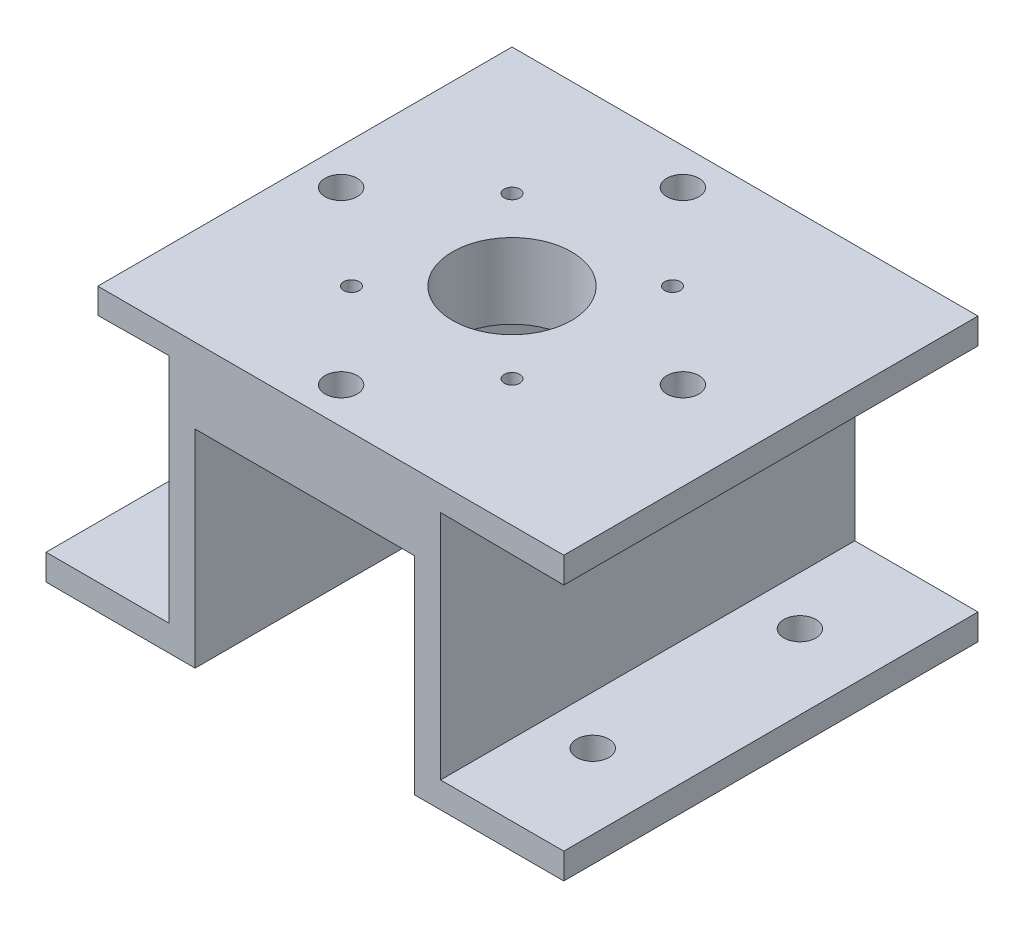
ISO-10303-21;
HEADER;
FILE_DESCRIPTION(('STEP AP214'),'2;1');
FILE_NAME('part.step','',(''),(''),'','','');
FILE_SCHEMA(('AUTOMOTIVE_DESIGN { 1 0 10303 214 1 1 1 1 }'));
ENDSEC;
DATA;
#1=APPLICATION_CONTEXT('core data for automotive mechanical design processes');
#2=APPLICATION_PROTOCOL_DEFINITION('international standard','automotive_design',2000,#1);
#3=PRODUCT_CONTEXT('',#1,'mechanical');
#4=PRODUCT('Part','Part','',(#3));
#5=PRODUCT_RELATED_PRODUCT_CATEGORY('part','',(#4));
#6=PRODUCT_DEFINITION_FORMATION('','',#4);
#7=PRODUCT_DEFINITION_CONTEXT('part definition',#1,'design');
#8=PRODUCT_DEFINITION('design','',#6,#7);
#9=PRODUCT_DEFINITION_SHAPE('','',#8);
#10=(LENGTH_UNIT() NAMED_UNIT(*) SI_UNIT(.MILLI.,.METRE.));
#11=(NAMED_UNIT(*) PLANE_ANGLE_UNIT() SI_UNIT($,.RADIAN.));
#12=(NAMED_UNIT(*) SI_UNIT($,.STERADIAN.) SOLID_ANGLE_UNIT());
#13=UNCERTAINTY_MEASURE_WITH_UNIT(LENGTH_MEASURE(1.E-05),#10,'distance_accuracy_value','');
#14=(GEOMETRIC_REPRESENTATION_CONTEXT(3) GLOBAL_UNCERTAINTY_ASSIGNED_CONTEXT((#13)) GLOBAL_UNIT_ASSIGNED_CONTEXT((#10,
#11,#12)) REPRESENTATION_CONTEXT('',''));
#15=CARTESIAN_POINT('',(0.,0.,0.));
#16=DIRECTION('',(0.,0.,1.));
#17=DIRECTION('',(1.,0.,0.));
#18=AXIS2_PLACEMENT_3D('',#15,#16,#17);
#19=CARTESIAN_POINT('',(21.2,0.,40.));
#20=DIRECTION('',(1.,0.,0.));
#21=DIRECTION('',(0.,1.,0.));
#22=AXIS2_PLACEMENT_3D('',#19,#20,#21);
#23=PLANE('',#22);
#24=DIRECTION('',(0.,-1.,0.));
#25=VECTOR('',#24,1.);
#26=CARTESIAN_POINT('',(21.2,0.,-40.));
#27=LINE('',#26,#25);
#28=CARTESIAN_POINT('',(21.2,0.,-40.));
#29=VERTEX_POINT('',#28);
#30=CARTESIAN_POINT('',(21.2,-40.,-40.));
#31=VERTEX_POINT('',#30);
#32=EDGE_CURVE('E176',#29,#31,#27,.T.);
#33=ORIENTED_EDGE('',*,*,#32,.T.);
#34=DIRECTION('',(0.,0.,-1.));
#35=VECTOR('',#34,1.);
#36=CARTESIAN_POINT('',(21.2,-40.,40.));
#37=LINE('',#36,#35);
#38=CARTESIAN_POINT('',(21.2,-40.,40.));
#39=VERTEX_POINT('',#38);
#40=EDGE_CURVE('E39',#39,#31,#37,.T.);
#41=ORIENTED_EDGE('',*,*,#40,.F.);
#42=DIRECTION('',(0.,-1.,0.));
#43=VECTOR('',#42,1.);
#44=CARTESIAN_POINT('',(21.2,0.,40.));
#45=LINE('',#44,#43);
#46=CARTESIAN_POINT('',(21.2,0.,40.));
#47=VERTEX_POINT('',#46);
#48=EDGE_CURVE('E209',#47,#39,#45,.T.);
#49=ORIENTED_EDGE('',*,*,#48,.F.);
#50=DIRECTION('',(0.,0.,-1.));
#51=VECTOR('',#50,1.);
#52=CARTESIAN_POINT('',(21.2,0.,40.));
#53=LINE('',#52,#51);
#54=EDGE_CURVE('E172',#47,#29,#53,.T.);
#55=ORIENTED_EDGE('',*,*,#54,.T.);
#56=EDGE_LOOP('',(#33,#41,#49,#55));
#57=FACE_BOUND('',#56,.T.);
#58=ADVANCED_FACE('F32',(#57),#23,.F.);
#59=CARTESIAN_POINT('',(21.2,-40.,40.));
#60=DIRECTION('',(0.,1.,0.));
#61=DIRECTION('',(0.,0.,1.));
#62=AXIS2_PLACEMENT_3D('',#59,#60,#61);
#63=PLANE('',#62);
#64=CARTESIAN_POINT('',(35.6,-40.,-20.));
#65=DIRECTION('',(0.,-1.,0.));
#66=DIRECTION('',(0.,0.,-1.));
#67=AXIS2_PLACEMENT_3D('',#64,#65,#66);
#68=CIRCLE('',#67,3.1);
#69=CARTESIAN_POINT('',(35.6,-40.,-23.1));
#70=VERTEX_POINT('',#69);
#71=EDGE_CURVE('E379',#70,#70,#68,.T.);
#72=ORIENTED_EDGE('',*,*,#71,.F.);
#73=EDGE_LOOP('',(#72));
#74=FACE_BOUND('',#73,.T.);
#75=CARTESIAN_POINT('',(35.6,-40.,20.));
#76=DIRECTION('',(0.,-1.,0.));
#77=DIRECTION('',(0.,0.,-1.));
#78=AXIS2_PLACEMENT_3D('',#75,#76,#77);
#79=CIRCLE('',#78,3.1);
#80=CARTESIAN_POINT('',(35.6,-40.,16.9));
#81=VERTEX_POINT('',#80);
#82=EDGE_CURVE('E382',#81,#81,#79,.T.);
#83=ORIENTED_EDGE('',*,*,#82,.F.);
#84=EDGE_LOOP('',(#83));
#85=FACE_BOUND('',#84,.T.);
#86=DIRECTION('',(1.,0.,0.));
#87=VECTOR('',#86,1.);
#88=CARTESIAN_POINT('',(21.2,-40.,-40.));
#89=LINE('',#88,#87);
#90=CARTESIAN_POINT('',(50.,-40.,-40.));
#91=VERTEX_POINT('',#90);
#92=EDGE_CURVE('E179',#31,#91,#89,.T.);
#93=ORIENTED_EDGE('',*,*,#92,.T.);
#94=DIRECTION('',(0.,0.,-1.));
#95=VECTOR('',#94,1.);
#96=CARTESIAN_POINT('',(50.,-40.,40.));
#97=LINE('',#96,#95);
#98=CARTESIAN_POINT('',(50.,-40.,40.));
#99=VERTEX_POINT('',#98);
#100=EDGE_CURVE('E237',#99,#91,#97,.T.);
#101=ORIENTED_EDGE('',*,*,#100,.F.);
#102=DIRECTION('',(1.,0.,0.));
#103=VECTOR('',#102,1.);
#104=CARTESIAN_POINT('',(21.2,-40.,40.));
#105=LINE('',#104,#103);
#106=EDGE_CURVE('E113',#39,#99,#105,.T.);
#107=ORIENTED_EDGE('',*,*,#106,.F.);
#108=ORIENTED_EDGE('',*,*,#40,.T.);
#109=EDGE_LOOP('',(#93,#101,#107,#108));
#110=FACE_BOUND('',#109,.T.);
#111=ADVANCED_FACE('F341',(#74,#85,#110),#63,.F.);
#112=CARTESIAN_POINT('',(50.,-35.,40.));
#113=DIRECTION('',(-1.,0.,0.));
#114=DIRECTION('',(0.,0.,1.));
#115=AXIS2_PLACEMENT_3D('',#112,#113,#114);
#116=PLANE('',#115);
#117=DIRECTION('',(0.,1.,0.));
#118=VECTOR('',#117,1.);
#119=CARTESIAN_POINT('',(50.,-35.,-40.));
#120=LINE('',#119,#118);
#121=CARTESIAN_POINT('',(50.,-35.,-40.));
#122=VERTEX_POINT('',#121);
#123=EDGE_CURVE('E182',#91,#122,#120,.T.);
#124=ORIENTED_EDGE('',*,*,#123,.T.);
#125=DIRECTION('',(0.,0.,-1.));
#126=VECTOR('',#125,1.);
#127=CARTESIAN_POINT('',(50.,-35.,40.));
#128=LINE('',#127,#126);
#129=CARTESIAN_POINT('',(50.,-35.,40.));
#130=VERTEX_POINT('',#129);
#131=EDGE_CURVE('E234',#130,#122,#128,.T.);
#132=ORIENTED_EDGE('',*,*,#131,.F.);
#133=DIRECTION('',(0.,1.,0.));
#134=VECTOR('',#133,1.);
#135=CARTESIAN_POINT('',(50.,-35.,40.));
#136=LINE('',#135,#134);
#137=EDGE_CURVE('E303',#99,#130,#136,.T.);
#138=ORIENTED_EDGE('',*,*,#137,.F.);
#139=ORIENTED_EDGE('',*,*,#100,.T.);
#140=EDGE_LOOP('',(#124,#132,#138,#139));
#141=FACE_BOUND('',#140,.T.);
#142=ADVANCED_FACE('F344',(#141),#116,.F.);
#143=CARTESIAN_POINT('',(26.2,-35.,40.));
#144=DIRECTION('',(0.,-1.,0.));
#145=DIRECTION('',(1.,0.,0.));
#146=AXIS2_PLACEMENT_3D('',#143,#144,#145);
#147=PLANE('',#146);
#148=CARTESIAN_POINT('',(35.6,-35.,-20.));
#149=DIRECTION('',(0.,-1.,0.));
#150=DIRECTION('',(1.,0.,0.));
#151=AXIS2_PLACEMENT_3D('',#148,#149,#150);
#152=CIRCLE('',#151,3.1);
#153=CARTESIAN_POINT('',(38.7,-35.,-20.));
#154=VERTEX_POINT('',#153);
#155=EDGE_CURVE('E269',#154,#154,#152,.T.);
#156=ORIENTED_EDGE('',*,*,#155,.T.);
#157=EDGE_LOOP('',(#156));
#158=FACE_BOUND('',#157,.T.);
#159=CARTESIAN_POINT('',(35.6,-35.,20.));
#160=DIRECTION('',(0.,-1.,0.));
#161=DIRECTION('',(1.,0.,0.));
#162=AXIS2_PLACEMENT_3D('',#159,#160,#161);
#163=CIRCLE('',#162,3.1);
#164=CARTESIAN_POINT('',(38.7,-35.,20.));
#165=VERTEX_POINT('',#164);
#166=EDGE_CURVE('E267',#165,#165,#163,.T.);
#167=ORIENTED_EDGE('',*,*,#166,.T.);
#168=EDGE_LOOP('',(#167));
#169=FACE_BOUND('',#168,.T.);
#170=DIRECTION('',(-1.,0.,0.));
#171=VECTOR('',#170,1.);
#172=CARTESIAN_POINT('',(26.2,-35.,-40.));
#173=LINE('',#172,#171);
#174=CARTESIAN_POINT('',(26.2,-35.,-40.));
#175=VERTEX_POINT('',#174);
#176=EDGE_CURVE('E184',#122,#175,#173,.T.);
#177=ORIENTED_EDGE('',*,*,#176,.T.);
#178=DIRECTION('',(0.,0.,-1.));
#179=VECTOR('',#178,1.);
#180=CARTESIAN_POINT('',(26.2,-35.,40.));
#181=LINE('',#180,#179);
#182=CARTESIAN_POINT('',(26.2,-35.,40.));
#183=VERTEX_POINT('',#182);
#184=EDGE_CURVE('E231',#183,#175,#181,.T.);
#185=ORIENTED_EDGE('',*,*,#184,.F.);
#186=DIRECTION('',(-1.,0.,0.));
#187=VECTOR('',#186,1.);
#188=CARTESIAN_POINT('',(26.2,-35.,40.));
#189=LINE('',#188,#187);
#190=EDGE_CURVE('E305',#130,#183,#189,.T.);
#191=ORIENTED_EDGE('',*,*,#190,.F.);
#192=ORIENTED_EDGE('',*,*,#131,.T.);
#193=EDGE_LOOP('',(#177,#185,#191,#192));
#194=FACE_BOUND('',#193,.T.);
#195=ADVANCED_FACE('F349',(#158,#169,#194),#147,.F.);
#196=CARTESIAN_POINT('',(26.2,5.,40.));
#197=DIRECTION('',(-1.,0.,0.));
#198=DIRECTION('',(0.,0.,1.));
#199=AXIS2_PLACEMENT_3D('',#196,#197,#198);
#200=PLANE('',#199);
#201=DIRECTION('',(0.,1.,0.));
#202=VECTOR('',#201,1.);
#203=CARTESIAN_POINT('',(26.2,5.,-40.));
#204=LINE('',#203,#202);
#205=CARTESIAN_POINT('',(26.2,9.75000000000001,-40.));
#206=VERTEX_POINT('',#205);
#207=EDGE_CURVE('E187',#175,#206,#204,.T.);
#208=ORIENTED_EDGE('',*,*,#207,.T.);
#209=DIRECTION('',(0.,0.,-1.));
#210=VECTOR('',#209,1.);
#211=CARTESIAN_POINT('',(26.2,9.75000000000001,40.));
#212=LINE('',#211,#210);
#213=CARTESIAN_POINT('',(26.2,9.75000000000001,40.));
#214=VERTEX_POINT('',#213);
#215=EDGE_CURVE('E228',#214,#206,#212,.T.);
#216=ORIENTED_EDGE('',*,*,#215,.F.);
#217=DIRECTION('',(0.,1.,0.));
#218=VECTOR('',#217,1.);
#219=CARTESIAN_POINT('',(26.2,5.,40.));
#220=LINE('',#219,#218);
#221=EDGE_CURVE('E307',#183,#214,#220,.T.);
#222=ORIENTED_EDGE('',*,*,#221,.F.);
#223=ORIENTED_EDGE('',*,*,#184,.T.);
#224=EDGE_LOOP('',(#208,#216,#222,#223));
#225=FACE_BOUND('',#224,.T.);
#226=ADVANCED_FACE('F355',(#225),#200,.F.);
#227=CARTESIAN_POINT('',(50.,9.5,40.));
#228=DIRECTION('',(0.0105036222209935,0.999944835438555,0.));
#229=DIRECTION('',(-0.999944835438555,0.0105036222209935,0.));
#230=AXIS2_PLACEMENT_3D('',#227,#228,#229);
#231=PLANE('',#230);
#232=CARTESIAN_POINT('',(33.,9.67857142857144,0.));
#233=DIRECTION('',(0.0105036222209935,0.999944835438555,0.));
#234=DIRECTION('',(-0.999944835438555,0.0105036222209935,0.));
#235=AXIS2_PLACEMENT_3D('',#232,#233,#234);
#236=ELLIPSE('',#235,3.1001710195747,3.1);
#237=CARTESIAN_POINT('',(29.9,9.71113445378152,0.));
#238=VERTEX_POINT('',#237);
#239=EDGE_CURVE('E266',#238,#238,#236,.T.);
#240=ORIENTED_EDGE('',*,*,#239,.T.);
#241=EDGE_LOOP('',(#240));
#242=FACE_BOUND('',#241,.T.);
#243=DIRECTION('',(0.999944835438555,-0.0105036222209935,0.));
#244=VECTOR('',#243,1.);
#245=CARTESIAN_POINT('',(50.,9.5,-40.));
#246=LINE('',#245,#244);
#247=CARTESIAN_POINT('',(50.,9.5,-40.));
#248=VERTEX_POINT('',#247);
#249=EDGE_CURVE('E189',#206,#248,#246,.T.);
#250=ORIENTED_EDGE('',*,*,#249,.T.);
#251=DIRECTION('',(0.,0.,-1.));
#252=VECTOR('',#251,1.);
#253=CARTESIAN_POINT('',(50.,9.5,40.));
#254=LINE('',#253,#252);
#255=CARTESIAN_POINT('',(50.,9.5,40.));
#256=VERTEX_POINT('',#255);
#257=EDGE_CURVE('E225',#256,#248,#254,.T.);
#258=ORIENTED_EDGE('',*,*,#257,.F.);
#259=DIRECTION('',(0.999944835438555,-0.0105036222209935,0.));
#260=VECTOR('',#259,1.);
#261=CARTESIAN_POINT('',(50.,9.5,40.));
#262=LINE('',#261,#260);
#263=EDGE_CURVE('E309',#214,#256,#262,.T.);
#264=ORIENTED_EDGE('',*,*,#263,.F.);
#265=ORIENTED_EDGE('',*,*,#215,.T.);
#266=EDGE_LOOP('',(#250,#258,#264,#265));
#267=FACE_BOUND('',#266,.T.);
#268=ADVANCED_FACE('F358',(#242,#267),#231,.F.);
#269=CARTESIAN_POINT('',(50.,14.5,40.));
#270=DIRECTION('',(-1.,0.,0.));
#271=DIRECTION('',(0.,0.,1.));
#272=AXIS2_PLACEMENT_3D('',#269,#270,#271);
#273=PLANE('',#272);
#274=DIRECTION('',(0.,1.,0.));
#275=VECTOR('',#274,1.);
#276=CARTESIAN_POINT('',(50.,14.5,-40.));
#277=LINE('',#276,#275);
#278=CARTESIAN_POINT('',(50.,14.5,-40.));
#279=VERTEX_POINT('',#278);
#280=EDGE_CURVE('E191',#248,#279,#277,.T.);
#281=ORIENTED_EDGE('',*,*,#280,.T.);
#282=DIRECTION('',(0.,0.,-1.));
#283=VECTOR('',#282,1.);
#284=CARTESIAN_POINT('',(50.,14.5,40.));
#285=LINE('',#284,#283);
#286=CARTESIAN_POINT('',(50.,14.5,40.));
#287=VERTEX_POINT('',#286);
#288=EDGE_CURVE('E222',#287,#279,#285,.T.);
#289=ORIENTED_EDGE('',*,*,#288,.F.);
#290=DIRECTION('',(0.,1.,0.));
#291=VECTOR('',#290,1.);
#292=CARTESIAN_POINT('',(50.,14.5,40.));
#293=LINE('',#292,#291);
#294=EDGE_CURVE('E311',#256,#287,#293,.T.);
#295=ORIENTED_EDGE('',*,*,#294,.F.);
#296=ORIENTED_EDGE('',*,*,#257,.T.);
#297=EDGE_LOOP('',(#281,#289,#295,#296));
#298=FACE_BOUND('',#297,.T.);
#299=ADVANCED_FACE('F363',(#298),#273,.F.);
#300=CARTESIAN_POINT('',(-26.15,14.5,40.));
#301=DIRECTION('',(0.,-1.,0.));
#302=DIRECTION('',(0.,0.,-1.));
#303=AXIS2_PLACEMENT_3D('',#300,#301,#302);
#304=PLANE('',#303);
#305=CARTESIAN_POINT('',(33.,14.5,0.));
#306=DIRECTION('',(0.,1.,0.));
#307=DIRECTION('',(0.,0.,1.));
#308=AXIS2_PLACEMENT_3D('',#305,#306,#307);
#309=CIRCLE('',#308,3.1);
#310=CARTESIAN_POINT('',(33.,14.5,3.1));
#311=VERTEX_POINT('',#310);
#312=EDGE_CURVE('E260',#311,#311,#309,.T.);
#313=ORIENTED_EDGE('',*,*,#312,.F.);
#314=EDGE_LOOP('',(#313));
#315=FACE_BOUND('',#314,.T.);
#316=CARTESIAN_POINT('',(-1.15218884181823E-13,14.5,33.));
#317=DIRECTION('',(0.,1.,0.));
#318=DIRECTION('',(0.,0.,1.));
#319=AXIS2_PLACEMENT_3D('',#316,#317,#318);
#320=CIRCLE('',#319,3.1);
#321=CARTESIAN_POINT('',(-1.15218884181823E-13,14.5,36.1));
#322=VERTEX_POINT('',#321);
#323=EDGE_CURVE('E281',#322,#322,#320,.T.);
#324=ORIENTED_EDGE('',*,*,#323,.F.);
#325=EDGE_LOOP('',(#324));
#326=FACE_BOUND('',#325,.T.);
#327=CARTESIAN_POINT('',(-33.,14.5,-2.30437768363647E-13));
#328=DIRECTION('',(0.,1.,0.));
#329=DIRECTION('',(0.,0.,1.));
#330=AXIS2_PLACEMENT_3D('',#327,#328,#329);
#331=CIRCLE('',#330,3.1);
#332=CARTESIAN_POINT('',(-33.,14.5,3.09999999999977));
#333=VERTEX_POINT('',#332);
#334=EDGE_CURVE('E276',#333,#333,#331,.T.);
#335=ORIENTED_EDGE('',*,*,#334,.F.);
#336=EDGE_LOOP('',(#335));
#337=FACE_BOUND('',#336,.T.);
#338=CARTESIAN_POINT('',(3.4565665254547E-13,14.5,-33.));
#339=DIRECTION('',(0.,1.,0.));
#340=DIRECTION('',(0.,0.,1.));
#341=AXIS2_PLACEMENT_3D('',#338,#339,#340);
#342=CIRCLE('',#341,3.1);
#343=CARTESIAN_POINT('',(3.4565665254547E-13,14.5,-29.9));
#344=VERTEX_POINT('',#343);
#345=EDGE_CURVE('E272',#344,#344,#342,.T.);
#346=ORIENTED_EDGE('',*,*,#345,.F.);
#347=EDGE_LOOP('',(#346));
#348=FACE_BOUND('',#347,.T.);
#349=CARTESIAN_POINT('',(15.5,14.5,-15.5));
#350=DIRECTION('',(0.,1.,0.));
#351=DIRECTION('',(0.,0.,1.));
#352=AXIS2_PLACEMENT_3D('',#349,#350,#351);
#353=CIRCLE('',#352,1.5);
#354=CARTESIAN_POINT('',(15.5,14.5,-14.));
#355=VERTEX_POINT('',#354);
#356=EDGE_CURVE('E287',#355,#355,#353,.T.);
#357=ORIENTED_EDGE('',*,*,#356,.F.);
#358=EDGE_LOOP('',(#357));
#359=FACE_BOUND('',#358,.T.);
#360=CARTESIAN_POINT('',(15.5,14.5,15.5));
#361=DIRECTION('',(0.,1.,0.));
#362=DIRECTION('',(0.,0.,1.));
#363=AXIS2_PLACEMENT_3D('',#360,#361,#362);
#364=CIRCLE('',#363,1.5);
#365=CARTESIAN_POINT('',(15.5,14.5,17.));
#366=VERTEX_POINT('',#365);
#367=EDGE_CURVE('E294',#366,#366,#364,.T.);
#368=ORIENTED_EDGE('',*,*,#367,.F.);
#369=EDGE_LOOP('',(#368));
#370=FACE_BOUND('',#369,.T.);
#371=CARTESIAN_POINT('',(-15.5,14.5,15.5));
#372=DIRECTION('',(0.,1.,0.));
#373=DIRECTION('',(0.,0.,1.));
#374=AXIS2_PLACEMENT_3D('',#371,#372,#373);
#375=CIRCLE('',#374,1.5);
#376=CARTESIAN_POINT('',(-15.5,14.5,17.));
#377=VERTEX_POINT('',#376);
#378=EDGE_CURVE('E291',#377,#377,#375,.T.);
#379=ORIENTED_EDGE('',*,*,#378,.F.);
#380=EDGE_LOOP('',(#379));
#381=FACE_BOUND('',#380,.T.);
#382=CARTESIAN_POINT('',(-15.5,14.5,-15.5));
#383=DIRECTION('',(0.,1.,0.));
#384=DIRECTION('',(0.,0.,1.));
#385=AXIS2_PLACEMENT_3D('',#382,#383,#384);
#386=CIRCLE('',#385,1.5);
#387=CARTESIAN_POINT('',(-15.5,14.5,-14.));
#388=VERTEX_POINT('',#387);
#389=EDGE_CURVE('E288',#388,#388,#386,.T.);
#390=ORIENTED_EDGE('',*,*,#389,.F.);
#391=EDGE_LOOP('',(#390));
#392=FACE_BOUND('',#391,.T.);
#393=CARTESIAN_POINT('',(0.,14.5,0.));
#394=DIRECTION('',(0.,1.,0.));
#395=DIRECTION('',(0.,0.,1.));
#396=AXIS2_PLACEMENT_3D('',#393,#394,#395);
#397=CIRCLE('',#396,11.5);
#398=CARTESIAN_POINT('',(0.,14.5,11.5));
#399=VERTEX_POINT('',#398);
#400=EDGE_CURVE('E245',#399,#399,#397,.T.);
#401=ORIENTED_EDGE('',*,*,#400,.F.);
#402=EDGE_LOOP('',(#401));
#403=FACE_BOUND('',#402,.T.);
#404=DIRECTION('',(-1.,0.,0.));
#405=VECTOR('',#404,1.);
#406=CARTESIAN_POINT('',(-26.15,14.5,-40.));
#407=LINE('',#406,#405);
#408=CARTESIAN_POINT('',(-40.,14.5,-40.));
#409=VERTEX_POINT('',#408);
#410=EDGE_CURVE('E194',#279,#409,#407,.T.);
#411=ORIENTED_EDGE('',*,*,#410,.T.);
#412=DIRECTION('',(0.,0.,-1.));
#413=VECTOR('',#412,1.);
#414=CARTESIAN_POINT('',(-40.,14.5,0.));
#415=LINE('',#414,#413);
#416=CARTESIAN_POINT('',(-40.,14.5,40.));
#417=VERTEX_POINT('',#416);
#418=EDGE_CURVE('E46',#417,#409,#415,.T.);
#419=ORIENTED_EDGE('',*,*,#418,.F.);
#420=DIRECTION('',(-1.,0.,0.));
#421=VECTOR('',#420,1.);
#422=CARTESIAN_POINT('',(26.15,14.5,40.));
#423=LINE('',#422,#421);
#424=EDGE_CURVE('E313',#287,#417,#423,.T.);
#425=ORIENTED_EDGE('',*,*,#424,.F.);
#426=ORIENTED_EDGE('',*,*,#288,.T.);
#427=EDGE_LOOP('',(#411,#419,#425,#426));
#428=FACE_BOUND('',#427,.T.);
#429=ADVANCED_FACE('F371',(#315,#326,#337,#348,#359,#370,#381,#392,#403,#428),#304,.F.);
#430=CARTESIAN_POINT('',(-50.,9.5,40.));
#431=DIRECTION('',(-0.0105036222209932,0.999944835438555,0.));
#432=DIRECTION('',(-0.999944835438555,-0.0105036222209932,0.));
#433=AXIS2_PLACEMENT_3D('',#430,#431,#432);
#434=PLANE('',#433);
#435=CARTESIAN_POINT('',(-33.,9.67857142857143,-2.30437768363647E-13));
#436=DIRECTION('',(-0.0105036222209932,0.999944835438555,0.));
#437=DIRECTION('',(0.999944835438555,0.0105036222209932,0.));
#438=AXIS2_PLACEMENT_3D('',#435,#436,#437);
#439=ELLIPSE('',#438,3.1001710195747,3.1);
#440=CARTESIAN_POINT('',(-29.9,9.71113445378151,-2.30437768363647E-13));
#441=VERTEX_POINT('',#440);
#442=EDGE_CURVE('E263',#441,#441,#439,.T.);
#443=ORIENTED_EDGE('',*,*,#442,.T.);
#444=EDGE_LOOP('',(#443));
#445=FACE_BOUND('',#444,.T.);
#446=DIRECTION('',(0.999944835438555,0.0105036222209932,0.));
#447=VECTOR('',#446,1.);
#448=CARTESIAN_POINT('',(-50.,9.5,40.));
#449=LINE('',#448,#447);
#450=CARTESIAN_POINT('',(-40.,9.60504201680672,40.));
#451=VERTEX_POINT('',#450);
#452=CARTESIAN_POINT('',(-26.2,9.75,40.));
#453=VERTEX_POINT('',#452);
#454=EDGE_CURVE('E316',#451,#453,#449,.T.);
#455=ORIENTED_EDGE('',*,*,#454,.F.);
#456=DIRECTION('',(0.,0.,-1.));
#457=VECTOR('',#456,1.);
#458=CARTESIAN_POINT('',(-40.,9.60504201680672,40.));
#459=LINE('',#458,#457);
#460=CARTESIAN_POINT('',(-40.,9.60504201680672,-40.));
#461=VERTEX_POINT('',#460);
#462=EDGE_CURVE('E373',#451,#461,#459,.T.);
#463=ORIENTED_EDGE('',*,*,#462,.T.);
#464=DIRECTION('',(0.999944835438555,0.0105036222209932,0.));
#465=VECTOR('',#464,1.);
#466=CARTESIAN_POINT('',(-50.,9.5,-40.));
#467=LINE('',#466,#465);
#468=CARTESIAN_POINT('',(-26.2,9.75,-40.));
#469=VERTEX_POINT('',#468);
#470=EDGE_CURVE('E197',#461,#469,#467,.T.);
#471=ORIENTED_EDGE('',*,*,#470,.T.);
#472=DIRECTION('',(0.,0.,-1.));
#473=VECTOR('',#472,1.);
#474=CARTESIAN_POINT('',(-26.2,9.75,40.));
#475=LINE('',#474,#473);
#476=EDGE_CURVE('E219',#453,#469,#475,.T.);
#477=ORIENTED_EDGE('',*,*,#476,.F.);
#478=EDGE_LOOP('',(#455,#463,#471,#477));
#479=FACE_BOUND('',#478,.T.);
#480=ADVANCED_FACE('F404',(#445,#479),#434,.F.);
#481=CARTESIAN_POINT('',(-26.2,4.99999999999999,40.));
#482=DIRECTION('',(1.,0.,0.));
#483=DIRECTION('',(0.,1.,0.));
#484=AXIS2_PLACEMENT_3D('',#481,#482,#483);
#485=PLANE('',#484);
#486=DIRECTION('',(0.,-1.,0.));
#487=VECTOR('',#486,1.);
#488=CARTESIAN_POINT('',(-26.2,4.99999999999999,-40.));
#489=LINE('',#488,#487);
#490=CARTESIAN_POINT('',(-26.2,-35.,-40.));
#491=VERTEX_POINT('',#490);
#492=EDGE_CURVE('E199',#469,#491,#489,.T.);
#493=ORIENTED_EDGE('',*,*,#492,.T.);
#494=DIRECTION('',(0.,0.,-1.));
#495=VECTOR('',#494,1.);
#496=CARTESIAN_POINT('',(-26.2,-35.,40.));
#497=LINE('',#496,#495);
#498=CARTESIAN_POINT('',(-26.2,-35.,40.));
#499=VERTEX_POINT('',#498);
#500=EDGE_CURVE('E216',#499,#491,#497,.T.);
#501=ORIENTED_EDGE('',*,*,#500,.F.);
#502=DIRECTION('',(0.,-1.,0.));
#503=VECTOR('',#502,1.);
#504=CARTESIAN_POINT('',(-26.2,4.99999999999999,40.));
#505=LINE('',#504,#503);
#506=EDGE_CURVE('E318',#453,#499,#505,.T.);
#507=ORIENTED_EDGE('',*,*,#506,.F.);
#508=ORIENTED_EDGE('',*,*,#476,.T.);
#509=EDGE_LOOP('',(#493,#501,#507,#508));
#510=FACE_BOUND('',#509,.T.);
#511=ADVANCED_FACE('F461',(#510),#485,.F.);
#512=CARTESIAN_POINT('',(-26.2,-35.,40.));
#513=DIRECTION('',(0.,-1.,0.));
#514=DIRECTION('',(0.,0.,-1.));
#515=AXIS2_PLACEMENT_3D('',#512,#513,#514);
#516=PLANE('',#515);
#517=CARTESIAN_POINT('',(-35.6,-35.,20.));
#518=DIRECTION('',(0.,-1.,0.));
#519=DIRECTION('',(0.,0.,-1.));
#520=AXIS2_PLACEMENT_3D('',#517,#518,#519);
#521=CIRCLE('',#520,3.1);
#522=CARTESIAN_POINT('',(-35.6,-35.,16.9));
#523=VERTEX_POINT('',#522);
#524=EDGE_CURVE('E270',#523,#523,#521,.T.);
#525=ORIENTED_EDGE('',*,*,#524,.T.);
#526=EDGE_LOOP('',(#525));
#527=FACE_BOUND('',#526,.T.);
#528=CARTESIAN_POINT('',(-35.6,-35.,-20.));
#529=DIRECTION('',(0.,-1.,0.));
#530=DIRECTION('',(0.,0.,-1.));
#531=AXIS2_PLACEMENT_3D('',#528,#529,#530);
#532=CIRCLE('',#531,3.1);
#533=CARTESIAN_POINT('',(-35.6,-35.,-23.1));
#534=VERTEX_POINT('',#533);
#535=EDGE_CURVE('E390',#534,#534,#532,.T.);
#536=ORIENTED_EDGE('',*,*,#535,.T.);
#537=EDGE_LOOP('',(#536));
#538=FACE_BOUND('',#537,.T.);
#539=DIRECTION('',(-1.,0.,0.));
#540=VECTOR('',#539,1.);
#541=CARTESIAN_POINT('',(-26.2,-35.,-40.));
#542=LINE('',#541,#540);
#543=CARTESIAN_POINT('',(-50.,-35.,-40.));
#544=VERTEX_POINT('',#543);
#545=EDGE_CURVE('E201',#491,#544,#542,.T.);
#546=ORIENTED_EDGE('',*,*,#545,.T.);
#547=DIRECTION('',(0.,0.,-1.));
#548=VECTOR('',#547,1.);
#549=CARTESIAN_POINT('',(-50.,-35.,40.));
#550=LINE('',#549,#548);
#551=CARTESIAN_POINT('',(-50.,-35.,40.));
#552=VERTEX_POINT('',#551);
#553=EDGE_CURVE('E213',#552,#544,#550,.T.);
#554=ORIENTED_EDGE('',*,*,#553,.F.);
#555=DIRECTION('',(-1.,0.,0.));
#556=VECTOR('',#555,1.);
#557=CARTESIAN_POINT('',(-26.2,-35.,40.));
#558=LINE('',#557,#556);
#559=EDGE_CURVE('E320',#499,#552,#558,.T.);
#560=ORIENTED_EDGE('',*,*,#559,.F.);
#561=ORIENTED_EDGE('',*,*,#500,.T.);
#562=EDGE_LOOP('',(#546,#554,#560,#561));
#563=FACE_BOUND('',#562,.T.);
#564=ADVANCED_FACE('F326',(#527,#538,#563),#516,.F.);
#565=CARTESIAN_POINT('',(-50.,-35.,40.));
#566=DIRECTION('',(1.,0.,0.));
#567=DIRECTION('',(0.,0.,-1.));
#568=AXIS2_PLACEMENT_3D('',#565,#566,#567);
#569=PLANE('',#568);
#570=DIRECTION('',(0.,-1.,0.));
#571=VECTOR('',#570,1.);
#572=CARTESIAN_POINT('',(-50.,-35.,-40.));
#573=LINE('',#572,#571);
#574=CARTESIAN_POINT('',(-50.,-40.,-40.));
#575=VERTEX_POINT('',#574);
#576=EDGE_CURVE('E203',#544,#575,#573,.T.);
#577=ORIENTED_EDGE('',*,*,#576,.T.);
#578=DIRECTION('',(0.,0.,-1.));
#579=VECTOR('',#578,1.);
#580=CARTESIAN_POINT('',(-50.,-40.,40.));
#581=LINE('',#580,#579);
#582=CARTESIAN_POINT('',(-50.,-40.,40.));
#583=VERTEX_POINT('',#582);
#584=EDGE_CURVE('E167',#583,#575,#581,.T.);
#585=ORIENTED_EDGE('',*,*,#584,.F.);
#586=DIRECTION('',(0.,-1.,0.));
#587=VECTOR('',#586,1.);
#588=CARTESIAN_POINT('',(-50.,-35.,40.));
#589=LINE('',#588,#587);
#590=EDGE_CURVE('E154',#552,#583,#589,.T.);
#591=ORIENTED_EDGE('',*,*,#590,.F.);
#592=ORIENTED_EDGE('',*,*,#553,.T.);
#593=EDGE_LOOP('',(#577,#585,#591,#592));
#594=FACE_BOUND('',#593,.T.);
#595=ADVANCED_FACE('F330',(#594),#569,.F.);
#596=CARTESIAN_POINT('',(-21.2,-40.,40.));
#597=DIRECTION('',(0.,1.,0.));
#598=DIRECTION('',(-1.,0.,0.));
#599=AXIS2_PLACEMENT_3D('',#596,#597,#598);
#600=PLANE('',#599);
#601=CARTESIAN_POINT('',(-35.6,-40.,20.));
#602=DIRECTION('',(0.,-1.,0.));
#603=DIRECTION('',(0.,0.,1.));
#604=AXIS2_PLACEMENT_3D('',#601,#602,#603);
#605=CIRCLE('',#604,3.1);
#606=CARTESIAN_POINT('',(-35.6,-40.,23.1));
#607=VERTEX_POINT('',#606);
#608=EDGE_CURVE('E378',#607,#607,#605,.T.);
#609=ORIENTED_EDGE('',*,*,#608,.F.);
#610=EDGE_LOOP('',(#609));
#611=FACE_BOUND('',#610,.T.);
#612=CARTESIAN_POINT('',(-35.6,-40.,-20.));
#613=DIRECTION('',(0.,-1.,0.));
#614=DIRECTION('',(0.,0.,1.));
#615=AXIS2_PLACEMENT_3D('',#612,#613,#614);
#616=CIRCLE('',#615,3.1);
#617=CARTESIAN_POINT('',(-35.6,-40.,-16.9));
#618=VERTEX_POINT('',#617);
#619=EDGE_CURVE('E383',#618,#618,#616,.T.);
#620=ORIENTED_EDGE('',*,*,#619,.F.);
#621=EDGE_LOOP('',(#620));
#622=FACE_BOUND('',#621,.T.);
#623=DIRECTION('',(1.,0.,0.));
#624=VECTOR('',#623,1.);
#625=CARTESIAN_POINT('',(-21.2,-40.,-40.));
#626=LINE('',#625,#624);
#627=CARTESIAN_POINT('',(-21.2,-40.,-40.));
#628=VERTEX_POINT('',#627);
#629=EDGE_CURVE('E163',#575,#628,#626,.T.);
#630=ORIENTED_EDGE('',*,*,#629,.T.);
#631=DIRECTION('',(0.,0.,-1.));
#632=VECTOR('',#631,1.);
#633=CARTESIAN_POINT('',(-21.2,-40.,40.));
#634=LINE('',#633,#632);
#635=CARTESIAN_POINT('',(-21.2,-40.,40.));
#636=VERTEX_POINT('',#635);
#637=EDGE_CURVE('E160',#636,#628,#634,.T.);
#638=ORIENTED_EDGE('',*,*,#637,.F.);
#639=DIRECTION('',(1.,0.,0.));
#640=VECTOR('',#639,1.);
#641=CARTESIAN_POINT('',(-21.2,-40.,40.));
#642=LINE('',#641,#640);
#643=EDGE_CURVE('E146',#583,#636,#642,.T.);
#644=ORIENTED_EDGE('',*,*,#643,.F.);
#645=ORIENTED_EDGE('',*,*,#584,.T.);
#646=EDGE_LOOP('',(#630,#638,#644,#645));
#647=FACE_BOUND('',#646,.T.);
#648=ADVANCED_FACE('F161',(#611,#622,#647),#600,.F.);
#649=CARTESIAN_POINT('',(-21.2,0.,40.));
#650=DIRECTION('',(-1.,0.,0.));
#651=DIRECTION('',(0.,-1.,0.));
#652=AXIS2_PLACEMENT_3D('',#649,#650,#651);
#653=PLANE('',#652);
#654=DIRECTION('',(0.,1.,0.));
#655=VECTOR('',#654,1.);
#656=CARTESIAN_POINT('',(-21.2,0.,-40.));
#657=LINE('',#656,#655);
#658=CARTESIAN_POINT('',(-21.2,0.,-40.));
#659=VERTEX_POINT('',#658);
#660=EDGE_CURVE('E206',#628,#659,#657,.T.);
#661=ORIENTED_EDGE('',*,*,#660,.T.);
#662=DIRECTION('',(0.,0.,-1.));
#663=VECTOR('',#662,1.);
#664=CARTESIAN_POINT('',(-21.2,0.,40.));
#665=LINE('',#664,#663);
#666=CARTESIAN_POINT('',(-21.2,0.,40.));
#667=VERTEX_POINT('',#666);
#668=EDGE_CURVE('E168',#667,#659,#665,.T.);
#669=ORIENTED_EDGE('',*,*,#668,.F.);
#670=DIRECTION('',(0.,1.,0.));
#671=VECTOR('',#670,1.);
#672=CARTESIAN_POINT('',(-21.2,0.,40.));
#673=LINE('',#672,#671);
#674=EDGE_CURVE('E151',#636,#667,#673,.T.);
#675=ORIENTED_EDGE('',*,*,#674,.F.);
#676=ORIENTED_EDGE('',*,*,#637,.T.);
#677=EDGE_LOOP('',(#661,#669,#675,#676));
#678=FACE_BOUND('',#677,.T.);
#679=ADVANCED_FACE('F170',(#678),#653,.F.);
#680=CARTESIAN_POINT('',(0.,0.,40.));
#681=DIRECTION('',(0.,1.,0.));
#682=DIRECTION('',(-1.,0.,0.));
#683=AXIS2_PLACEMENT_3D('',#680,#681,#682);
#684=PLANE('',#683);
#685=CARTESIAN_POINT('',(-1.15218884181823E-13,0.,33.));
#686=DIRECTION('',(0.,1.,0.));
#687=DIRECTION('',(-1.,0.,0.));
#688=AXIS2_PLACEMENT_3D('',#685,#686,#687);
#689=CIRCLE('',#688,3.1);
#690=CARTESIAN_POINT('',(-3.10000000000011,0.,33.));
#691=VERTEX_POINT('',#690);
#692=EDGE_CURVE('E259',#691,#691,#689,.T.);
#693=ORIENTED_EDGE('',*,*,#692,.T.);
#694=EDGE_LOOP('',(#693));
#695=FACE_BOUND('',#694,.T.);
#696=CARTESIAN_POINT('',(3.4565665254547E-13,0.,-33.));
#697=DIRECTION('',(0.,1.,0.));
#698=DIRECTION('',(-1.,0.,0.));
#699=AXIS2_PLACEMENT_3D('',#696,#697,#698);
#700=CIRCLE('',#699,3.1);
#701=CARTESIAN_POINT('',(-3.09999999999965,0.,-33.));
#702=VERTEX_POINT('',#701);
#703=EDGE_CURVE('E256',#702,#702,#700,.T.);
#704=ORIENTED_EDGE('',*,*,#703,.T.);
#705=EDGE_LOOP('',(#704));
#706=FACE_BOUND('',#705,.T.);
#707=CARTESIAN_POINT('',(15.5,0.,-15.5));
#708=DIRECTION('',(0.,1.,0.));
#709=DIRECTION('',(-1.,0.,0.));
#710=AXIS2_PLACEMENT_3D('',#707,#708,#709);
#711=CIRCLE('',#710,1.5);
#712=CARTESIAN_POINT('',(14.,0.,-15.5));
#713=VERTEX_POINT('',#712);
#714=EDGE_CURVE('E180',#713,#713,#711,.T.);
#715=ORIENTED_EDGE('',*,*,#714,.T.);
#716=EDGE_LOOP('',(#715));
#717=FACE_BOUND('',#716,.T.);
#718=CARTESIAN_POINT('',(15.5,0.,15.5));
#719=DIRECTION('',(0.,1.,0.));
#720=DIRECTION('',(-1.,0.,0.));
#721=AXIS2_PLACEMENT_3D('',#718,#719,#720);
#722=CIRCLE('',#721,1.5);
#723=CARTESIAN_POINT('',(14.,0.,15.5));
#724=VERTEX_POINT('',#723);
#725=EDGE_CURVE('E251',#724,#724,#722,.T.);
#726=ORIENTED_EDGE('',*,*,#725,.T.);
#727=EDGE_LOOP('',(#726));
#728=FACE_BOUND('',#727,.T.);
#729=CARTESIAN_POINT('',(-15.5,0.,15.5));
#730=DIRECTION('',(0.,1.,0.));
#731=DIRECTION('',(-1.,0.,0.));
#732=AXIS2_PLACEMENT_3D('',#729,#730,#731);
#733=CIRCLE('',#732,1.5);
#734=CARTESIAN_POINT('',(-17.,0.,15.5));
#735=VERTEX_POINT('',#734);
#736=EDGE_CURVE('E248',#735,#735,#733,.T.);
#737=ORIENTED_EDGE('',*,*,#736,.T.);
#738=EDGE_LOOP('',(#737));
#739=FACE_BOUND('',#738,.T.);
#740=CARTESIAN_POINT('',(-15.5,0.,-15.5));
#741=DIRECTION('',(0.,1.,0.));
#742=DIRECTION('',(-1.,0.,0.));
#743=AXIS2_PLACEMENT_3D('',#740,#741,#742);
#744=CIRCLE('',#743,1.5);
#745=CARTESIAN_POINT('',(-17.,0.,-15.5));
#746=VERTEX_POINT('',#745);
#747=EDGE_CURVE('E244',#746,#746,#744,.T.);
#748=ORIENTED_EDGE('',*,*,#747,.T.);
#749=EDGE_LOOP('',(#748));
#750=FACE_BOUND('',#749,.T.);
#751=CARTESIAN_POINT('',(0.,0.,0.));
#752=DIRECTION('',(0.,1.,0.));
#753=DIRECTION('',(-1.,0.,0.));
#754=AXIS2_PLACEMENT_3D('',#751,#752,#753);
#755=CIRCLE('',#754,11.5);
#756=CARTESIAN_POINT('',(-11.5,0.,0.));
#757=VERTEX_POINT('',#756);
#758=EDGE_CURVE('E241',#757,#757,#755,.T.);
#759=ORIENTED_EDGE('',*,*,#758,.T.);
#760=EDGE_LOOP('',(#759));
#761=FACE_BOUND('',#760,.T.);
#762=DIRECTION('',(1.,0.,0.));
#763=VECTOR('',#762,1.);
#764=CARTESIAN_POINT('',(0.,0.,-40.));
#765=LINE('',#764,#763);
#766=EDGE_CURVE('E104',#659,#29,#765,.T.);
#767=ORIENTED_EDGE('',*,*,#766,.T.);
#768=ORIENTED_EDGE('',*,*,#54,.F.);
#769=DIRECTION('',(1.,0.,0.));
#770=VECTOR('',#769,1.);
#771=CARTESIAN_POINT('',(0.,0.,40.));
#772=LINE('',#771,#770);
#773=EDGE_CURVE('E54',#667,#47,#772,.T.);
#774=ORIENTED_EDGE('',*,*,#773,.F.);
#775=ORIENTED_EDGE('',*,*,#668,.T.);
#776=EDGE_LOOP('',(#767,#768,#774,#775));
#777=FACE_BOUND('',#776,.T.);
#778=ADVANCED_FACE('F335',(#695,#706,#717,#728,#739,#750,#761,#777),#684,.F.);
#779=CARTESIAN_POINT('',(0.,0.,40.));
#780=DIRECTION('',(0.,0.,1.));
#781=DIRECTION('',(1.,0.,0.));
#782=AXIS2_PLACEMENT_3D('',#779,#780,#781);
#783=PLANE('',#782);
#784=DIRECTION('',(0.,1.,0.));
#785=VECTOR('',#784,1.);
#786=CARTESIAN_POINT('',(-40.,4.5,40.));
#787=LINE('',#786,#785);
#788=EDGE_CURVE('E367',#451,#417,#787,.T.);
#789=ORIENTED_EDGE('',*,*,#788,.F.);
#790=ORIENTED_EDGE('',*,*,#454,.T.);
#791=ORIENTED_EDGE('',*,*,#506,.T.);
#792=ORIENTED_EDGE('',*,*,#559,.T.);
#793=ORIENTED_EDGE('',*,*,#590,.T.);
#794=ORIENTED_EDGE('',*,*,#643,.T.);
#795=ORIENTED_EDGE('',*,*,#674,.T.);
#796=ORIENTED_EDGE('',*,*,#773,.T.);
#797=ORIENTED_EDGE('',*,*,#48,.T.);
#798=ORIENTED_EDGE('',*,*,#106,.T.);
#799=ORIENTED_EDGE('',*,*,#137,.T.);
#800=ORIENTED_EDGE('',*,*,#190,.T.);
#801=ORIENTED_EDGE('',*,*,#221,.T.);
#802=ORIENTED_EDGE('',*,*,#263,.T.);
#803=ORIENTED_EDGE('',*,*,#294,.T.);
#804=ORIENTED_EDGE('',*,*,#424,.T.);
#805=EDGE_LOOP('',(#789,#790,#791,#792,#793,#794,#795,#796,#797,#798,#799,#800,#801,#802,#803,#804));
#806=FACE_BOUND('',#805,.T.);
#807=ADVANCED_FACE('F149',(#806),#783,.T.);
#808=CARTESIAN_POINT('',(0.,0.,-40.));
#809=DIRECTION('',(0.,0.,1.));
#810=DIRECTION('',(1.,0.,0.));
#811=AXIS2_PLACEMENT_3D('',#808,#809,#810);
#812=PLANE('',#811);
#813=ORIENTED_EDGE('',*,*,#470,.F.);
#814=DIRECTION('',(0.,1.,0.));
#815=VECTOR('',#814,1.);
#816=CARTESIAN_POINT('',(-40.,0.,-40.));
#817=LINE('',#816,#815);
#818=EDGE_CURVE('E11',#461,#409,#817,.T.);
#819=ORIENTED_EDGE('',*,*,#818,.T.);
#820=ORIENTED_EDGE('',*,*,#410,.F.);
#821=ORIENTED_EDGE('',*,*,#280,.F.);
#822=ORIENTED_EDGE('',*,*,#249,.F.);
#823=ORIENTED_EDGE('',*,*,#207,.F.);
#824=ORIENTED_EDGE('',*,*,#176,.F.);
#825=ORIENTED_EDGE('',*,*,#123,.F.);
#826=ORIENTED_EDGE('',*,*,#92,.F.);
#827=ORIENTED_EDGE('',*,*,#32,.F.);
#828=ORIENTED_EDGE('',*,*,#766,.F.);
#829=ORIENTED_EDGE('',*,*,#660,.F.);
#830=ORIENTED_EDGE('',*,*,#629,.F.);
#831=ORIENTED_EDGE('',*,*,#576,.F.);
#832=ORIENTED_EDGE('',*,*,#545,.F.);
#833=ORIENTED_EDGE('',*,*,#492,.F.);
#834=EDGE_LOOP('',(#813,#819,#820,#821,#822,#823,#824,#825,#826,#827,#828,#829,#830,#831,#832,#833));
#835=FACE_BOUND('',#834,.T.);
#836=ADVANCED_FACE('F333',(#835),#812,.F.);
#837=CARTESIAN_POINT('',(0.,-65.5,0.));
#838=DIRECTION('',(0.,1.,0.));
#839=DIRECTION('',(0.,0.,1.));
#840=AXIS2_PLACEMENT_3D('',#837,#838,#839);
#841=CYLINDRICAL_SURFACE('',#840,11.5);
#842=ORIENTED_EDGE('',*,*,#400,.T.);
#843=EDGE_LOOP('',(#842));
#844=FACE_BOUND('',#843,.T.);
#845=ORIENTED_EDGE('',*,*,#758,.F.);
#846=EDGE_LOOP('',(#845));
#847=FACE_BOUND('',#846,.T.);
#848=ADVANCED_FACE('F420',(#844,#847),#841,.F.);
#849=CARTESIAN_POINT('',(-15.5,-65.5,-15.5));
#850=DIRECTION('',(0.,1.,0.));
#851=DIRECTION('',(0.,0.,1.));
#852=AXIS2_PLACEMENT_3D('',#849,#850,#851);
#853=CYLINDRICAL_SURFACE('',#852,1.5);
#854=ORIENTED_EDGE('',*,*,#389,.T.);
#855=EDGE_LOOP('',(#854));
#856=FACE_BOUND('',#855,.T.);
#857=ORIENTED_EDGE('',*,*,#747,.F.);
#858=EDGE_LOOP('',(#857));
#859=FACE_BOUND('',#858,.T.);
#860=ADVANCED_FACE('F423',(#856,#859),#853,.F.);
#861=CARTESIAN_POINT('',(-15.5,-65.5,15.5));
#862=DIRECTION('',(0.,1.,0.));
#863=DIRECTION('',(0.,0.,1.));
#864=AXIS2_PLACEMENT_3D('',#861,#862,#863);
#865=CYLINDRICAL_SURFACE('',#864,1.5);
#866=ORIENTED_EDGE('',*,*,#378,.T.);
#867=EDGE_LOOP('',(#866));
#868=FACE_BOUND('',#867,.T.);
#869=ORIENTED_EDGE('',*,*,#736,.F.);
#870=EDGE_LOOP('',(#869));
#871=FACE_BOUND('',#870,.T.);
#872=ADVANCED_FACE('F515',(#868,#871),#865,.F.);
#873=CARTESIAN_POINT('',(15.5,-65.5,15.5));
#874=DIRECTION('',(0.,1.,0.));
#875=DIRECTION('',(0.,0.,1.));
#876=AXIS2_PLACEMENT_3D('',#873,#874,#875);
#877=CYLINDRICAL_SURFACE('',#876,1.5);
#878=ORIENTED_EDGE('',*,*,#367,.T.);
#879=EDGE_LOOP('',(#878));
#880=FACE_BOUND('',#879,.T.);
#881=ORIENTED_EDGE('',*,*,#725,.F.);
#882=EDGE_LOOP('',(#881));
#883=FACE_BOUND('',#882,.T.);
#884=ADVANCED_FACE('F519',(#880,#883),#877,.F.);
#885=CARTESIAN_POINT('',(15.5,-65.5,-15.5));
#886=DIRECTION('',(0.,1.,0.));
#887=DIRECTION('',(0.,0.,1.));
#888=AXIS2_PLACEMENT_3D('',#885,#886,#887);
#889=CYLINDRICAL_SURFACE('',#888,1.5);
#890=ORIENTED_EDGE('',*,*,#356,.T.);
#891=EDGE_LOOP('',(#890));
#892=FACE_BOUND('',#891,.T.);
#893=ORIENTED_EDGE('',*,*,#714,.F.);
#894=EDGE_LOOP('',(#893));
#895=FACE_BOUND('',#894,.T.);
#896=ADVANCED_FACE('F512',(#892,#895),#889,.F.);
#897=CARTESIAN_POINT('',(3.4565665254547E-13,-25.5,-33.));
#898=DIRECTION('',(0.,1.,0.));
#899=DIRECTION('',(0.,0.,1.));
#900=AXIS2_PLACEMENT_3D('',#897,#898,#899);
#901=CYLINDRICAL_SURFACE('',#900,3.1);
#902=ORIENTED_EDGE('',*,*,#345,.T.);
#903=EDGE_LOOP('',(#902));
#904=FACE_BOUND('',#903,.T.);
#905=ORIENTED_EDGE('',*,*,#703,.F.);
#906=EDGE_LOOP('',(#905));
#907=FACE_BOUND('',#906,.T.);
#908=ADVANCED_FACE('F506',(#904,#907),#901,.F.);
#909=CARTESIAN_POINT('',(-1.15218884181823E-13,-25.5,33.));
#910=DIRECTION('',(0.,1.,0.));
#911=DIRECTION('',(0.,0.,1.));
#912=AXIS2_PLACEMENT_3D('',#909,#910,#911);
#913=CYLINDRICAL_SURFACE('',#912,3.1);
#914=ORIENTED_EDGE('',*,*,#323,.T.);
#915=EDGE_LOOP('',(#914));
#916=FACE_BOUND('',#915,.T.);
#917=ORIENTED_EDGE('',*,*,#692,.F.);
#918=EDGE_LOOP('',(#917));
#919=FACE_BOUND('',#918,.T.);
#920=ADVANCED_FACE('F399',(#916,#919),#913,.F.);
#921=CARTESIAN_POINT('',(-33.,-25.5,-2.30437768363647E-13));
#922=DIRECTION('',(0.,1.,0.));
#923=DIRECTION('',(0.,0.,1.));
#924=AXIS2_PLACEMENT_3D('',#921,#922,#923);
#925=CYLINDRICAL_SURFACE('',#924,3.1);
#926=ORIENTED_EDGE('',*,*,#334,.T.);
#927=EDGE_LOOP('',(#926));
#928=FACE_BOUND('',#927,.T.);
#929=ORIENTED_EDGE('',*,*,#442,.F.);
#930=EDGE_LOOP('',(#929));
#931=FACE_BOUND('',#930,.T.);
#932=ADVANCED_FACE('F494',(#928,#931),#925,.F.);
#933=CARTESIAN_POINT('',(33.,-25.5,0.));
#934=DIRECTION('',(0.,1.,0.));
#935=DIRECTION('',(0.,0.,1.));
#936=AXIS2_PLACEMENT_3D('',#933,#934,#935);
#937=CYLINDRICAL_SURFACE('',#936,3.1);
#938=ORIENTED_EDGE('',*,*,#312,.T.);
#939=EDGE_LOOP('',(#938));
#940=FACE_BOUND('',#939,.T.);
#941=ORIENTED_EDGE('',*,*,#239,.F.);
#942=EDGE_LOOP('',(#941));
#943=FACE_BOUND('',#942,.T.);
#944=ADVANCED_FACE('F483',(#940,#943),#937,.F.);
#945=CARTESIAN_POINT('',(-35.6,-30.,-20.));
#946=DIRECTION('',(0.,-1.,0.));
#947=DIRECTION('',(0.,0.,-1.));
#948=AXIS2_PLACEMENT_3D('',#945,#946,#947);
#949=CYLINDRICAL_SURFACE('',#948,3.1);
#950=ORIENTED_EDGE('',*,*,#619,.T.);
#951=EDGE_LOOP('',(#950));
#952=FACE_BOUND('',#951,.T.);
#953=ORIENTED_EDGE('',*,*,#535,.F.);
#954=EDGE_LOOP('',(#953));
#955=FACE_BOUND('',#954,.T.);
#956=ADVANCED_FACE('F479',(#952,#955),#949,.F.);
#957=CARTESIAN_POINT('',(-35.6,-30.,20.));
#958=DIRECTION('',(0.,-1.,0.));
#959=DIRECTION('',(0.,0.,-1.));
#960=AXIS2_PLACEMENT_3D('',#957,#958,#959);
#961=CYLINDRICAL_SURFACE('',#960,3.1);
#962=ORIENTED_EDGE('',*,*,#608,.T.);
#963=EDGE_LOOP('',(#962));
#964=FACE_BOUND('',#963,.T.);
#965=ORIENTED_EDGE('',*,*,#524,.F.);
#966=EDGE_LOOP('',(#965));
#967=FACE_BOUND('',#966,.T.);
#968=ADVANCED_FACE('F482',(#964,#967),#961,.F.);
#969=CARTESIAN_POINT('',(35.6,-30.,20.));
#970=DIRECTION('',(0.,-1.,0.));
#971=DIRECTION('',(0.,0.,-1.));
#972=AXIS2_PLACEMENT_3D('',#969,#970,#971);
#973=CYLINDRICAL_SURFACE('',#972,3.1);
#974=ORIENTED_EDGE('',*,*,#82,.T.);
#975=EDGE_LOOP('',(#974));
#976=FACE_BOUND('',#975,.T.);
#977=ORIENTED_EDGE('',*,*,#166,.F.);
#978=EDGE_LOOP('',(#977));
#979=FACE_BOUND('',#978,.T.);
#980=ADVANCED_FACE('F491',(#976,#979),#973,.F.);
#981=CARTESIAN_POINT('',(35.6,-30.,-20.));
#982=DIRECTION('',(0.,-1.,0.));
#983=DIRECTION('',(0.,0.,-1.));
#984=AXIS2_PLACEMENT_3D('',#981,#982,#983);
#985=CYLINDRICAL_SURFACE('',#984,3.1);
#986=ORIENTED_EDGE('',*,*,#71,.T.);
#987=EDGE_LOOP('',(#986));
#988=FACE_BOUND('',#987,.T.);
#989=ORIENTED_EDGE('',*,*,#155,.F.);
#990=EDGE_LOOP('',(#989));
#991=FACE_BOUND('',#990,.T.);
#992=ADVANCED_FACE('F498',(#988,#991),#985,.F.);
#993=CARTESIAN_POINT('',(-40.,4.5,0.));
#994=DIRECTION('',(1.,0.,0.));
#995=DIRECTION('',(0.,0.,-1.));
#996=AXIS2_PLACEMENT_3D('',#993,#994,#995);
#997=PLANE('',#996);
#998=ORIENTED_EDGE('',*,*,#788,.T.);
#999=ORIENTED_EDGE('',*,*,#418,.T.);
#1000=ORIENTED_EDGE('',*,*,#818,.F.);
#1001=ORIENTED_EDGE('',*,*,#462,.F.);
#1002=EDGE_LOOP('',(#998,#999,#1000,#1001));
#1003=FACE_BOUND('',#1002,.T.);
#1004=ADVANCED_FACE('F621',(#1003),#997,.F.);
#1005=CLOSED_SHELL('',(#58,#111,#142,#195,#226,#268,#299,#429,#480,#511,#564,#595,#648,#679,
#778,#807,#836,#848,#860,#872,#884,#896,#908,#920,#932,#944,#956,#968,#980,#992,#1004));
#1006=MANIFOLD_SOLID_BREP('B2',#1005);
#1007=ADVANCED_BREP_SHAPE_REPRESENTATION('',(#18,#1006),#14);
#1008=SHAPE_DEFINITION_REPRESENTATION(#9,#1007);
ENDSEC;
END-ISO-10303-21;
